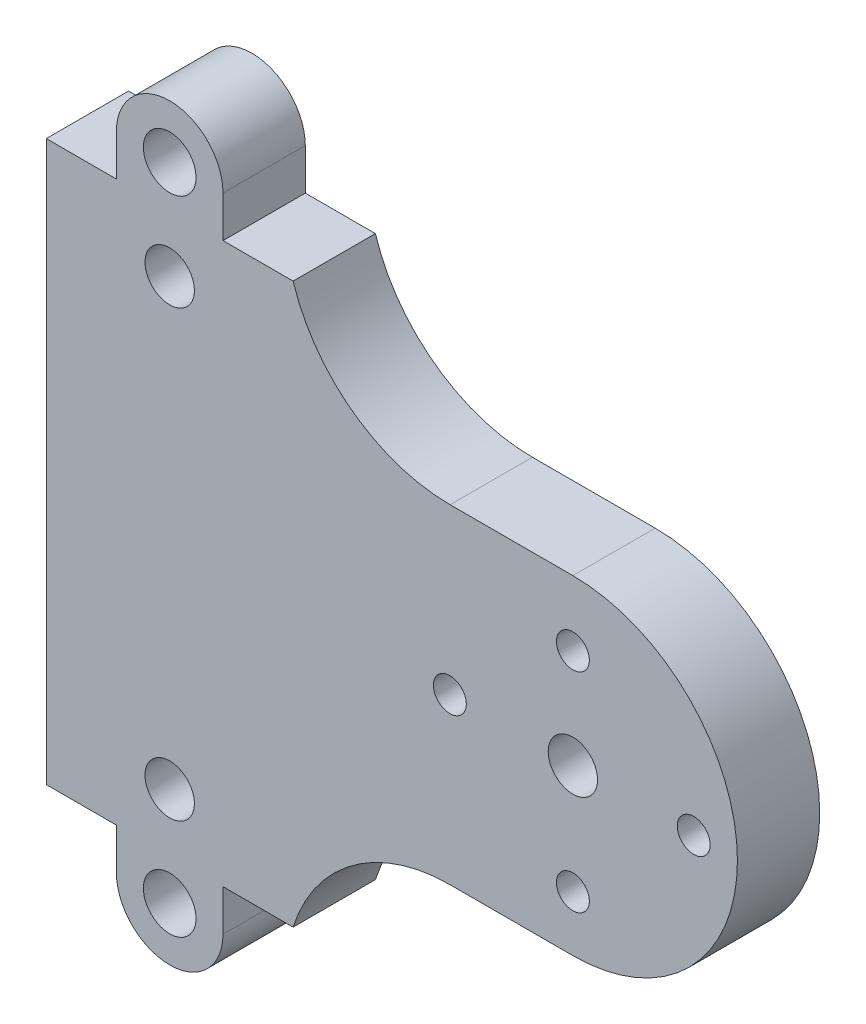
ISO-10303-21;
HEADER;
FILE_DESCRIPTION(('STEP AP214'),'2;1');
FILE_NAME('part.step','',(''),(''),'','','');
FILE_SCHEMA(('AUTOMOTIVE_DESIGN { 1 0 10303 214 1 1 1 1 }'));
ENDSEC;
DATA;
#1=APPLICATION_CONTEXT('core data for automotive mechanical design processes');
#2=APPLICATION_PROTOCOL_DEFINITION('international standard','automotive_design',2000,#1);
#3=PRODUCT_CONTEXT('',#1,'mechanical');
#4=PRODUCT('Part','Part','',(#3));
#5=PRODUCT_RELATED_PRODUCT_CATEGORY('part','',(#4));
#6=PRODUCT_DEFINITION_FORMATION('','',#4);
#7=PRODUCT_DEFINITION_CONTEXT('part definition',#1,'design');
#8=PRODUCT_DEFINITION('design','',#6,#7);
#9=PRODUCT_DEFINITION_SHAPE('','',#8);
#10=(LENGTH_UNIT() NAMED_UNIT(*) SI_UNIT(.MILLI.,.METRE.));
#11=(NAMED_UNIT(*) PLANE_ANGLE_UNIT() SI_UNIT($,.RADIAN.));
#12=(NAMED_UNIT(*) SI_UNIT($,.STERADIAN.) SOLID_ANGLE_UNIT());
#13=UNCERTAINTY_MEASURE_WITH_UNIT(LENGTH_MEASURE(1.E-05),#10,'distance_accuracy_value','');
#14=(GEOMETRIC_REPRESENTATION_CONTEXT(3) GLOBAL_UNCERTAINTY_ASSIGNED_CONTEXT((#13)) GLOBAL_UNIT_ASSIGNED_CONTEXT((#10,
#11,#12)) REPRESENTATION_CONTEXT('',''));
#15=CARTESIAN_POINT('',(0.,0.,0.));
#16=DIRECTION('',(0.,0.,1.));
#17=DIRECTION('',(1.,0.,0.));
#18=AXIS2_PLACEMENT_3D('',#15,#16,#17);
#19=CARTESIAN_POINT('',(-21.5845968576232,7.70287081339713,5.));
#20=DIRECTION('',(0.,-1.,0.));
#21=DIRECTION('',(1.,0.,0.));
#22=AXIS2_PLACEMENT_3D('',#19,#20,#21);
#23=PLANE('',#22);
#24=DIRECTION('',(-1.,0.,0.));
#25=VECTOR('',#24,1.);
#26=CARTESIAN_POINT('',(-21.5845968576232,7.70287081339713,0.));
#27=LINE('',#26,#25);
#28=CARTESIAN_POINT('',(-12.3245968576232,7.70287081339713,0.));
#29=VERTEX_POINT('',#28);
#30=CARTESIAN_POINT('',(-16.5845968576232,7.70287081339713,0.));
#31=VERTEX_POINT('',#30);
#32=EDGE_CURVE('E252',#29,#31,#27,.T.);
#33=ORIENTED_EDGE('',*,*,#32,.T.);
#34=DIRECTION('',(0.,0.,1.));
#35=VECTOR('',#34,1.);
#36=CARTESIAN_POINT('',(-16.5845968576232,7.70287081339713,5.));
#37=LINE('',#36,#35);
#38=CARTESIAN_POINT('',(-16.5845968576232,7.70287081339713,5.));
#39=VERTEX_POINT('',#38);
#40=EDGE_CURVE('E185',#31,#39,#37,.T.);
#41=ORIENTED_EDGE('',*,*,#40,.T.);
#42=DIRECTION('',(-1.,0.,0.));
#43=VECTOR('',#42,1.);
#44=CARTESIAN_POINT('',(-21.5845968576232,7.70287081339713,5.));
#45=LINE('',#44,#43);
#46=CARTESIAN_POINT('',(-12.3245968576232,7.70287081339713,5.));
#47=VERTEX_POINT('',#46);
#48=EDGE_CURVE('E264',#47,#39,#45,.T.);
#49=ORIENTED_EDGE('',*,*,#48,.F.);
#50=DIRECTION('',(0.,0.,-1.));
#51=VECTOR('',#50,1.);
#52=CARTESIAN_POINT('',(-12.3245968576232,7.70287081339713,5.));
#53=LINE('',#52,#51);
#54=EDGE_CURVE('E275',#47,#29,#53,.T.);
#55=ORIENTED_EDGE('',*,*,#54,.T.);
#56=EDGE_LOOP('',(#33,#41,#49,#55));
#57=FACE_BOUND('',#56,.T.);
#58=ADVANCED_FACE('F33',(#57),#23,.F.);
#59=CARTESIAN_POINT('',(-21.5845968576232,-26.2971291866029,5.));
#60=DIRECTION('',(0.,1.,0.));
#61=DIRECTION('',(-1.,0.,0.));
#62=AXIS2_PLACEMENT_3D('',#59,#60,#61);
#63=PLANE('',#62);
#64=DIRECTION('',(1.,0.,0.));
#65=VECTOR('',#64,1.);
#66=CARTESIAN_POINT('',(-21.5845968576232,-26.2971291866029,0.));
#67=LINE('',#66,#65);
#68=CARTESIAN_POINT('',(-5.84459685762318,-26.2971291866029,0.));
#69=VERTEX_POINT('',#68);
#70=CARTESIAN_POINT('',(-1.58459685762318,-26.2971291866029,0.));
#71=VERTEX_POINT('',#70);
#72=EDGE_CURVE('E261',#69,#71,#67,.T.);
#73=ORIENTED_EDGE('',*,*,#72,.T.);
#74=DIRECTION('',(0.,0.,1.));
#75=VECTOR('',#74,1.);
#76=CARTESIAN_POINT('',(-1.58459685762318,-26.2971291866029,5.));
#77=LINE('',#76,#75);
#78=CARTESIAN_POINT('',(-1.58459685762318,-26.2971291866029,5.));
#79=VERTEX_POINT('',#78);
#80=EDGE_CURVE('E181',#71,#79,#77,.T.);
#81=ORIENTED_EDGE('',*,*,#80,.T.);
#82=DIRECTION('',(1.,0.,0.));
#83=VECTOR('',#82,1.);
#84=CARTESIAN_POINT('',(-21.5845968576232,-26.2971291866029,5.));
#85=LINE('',#84,#83);
#86=CARTESIAN_POINT('',(-5.84459685762318,-26.2971291866029,5.));
#87=VERTEX_POINT('',#86);
#88=EDGE_CURVE('E258',#87,#79,#85,.T.);
#89=ORIENTED_EDGE('',*,*,#88,.F.);
#90=DIRECTION('',(0.,0.,-1.));
#91=VECTOR('',#90,1.);
#92=CARTESIAN_POINT('',(-5.84459685762318,-26.2971291866029,5.));
#93=LINE('',#92,#91);
#94=EDGE_CURVE('E269',#87,#69,#93,.T.);
#95=ORIENTED_EDGE('',*,*,#94,.T.);
#96=EDGE_LOOP('',(#73,#81,#89,#95));
#97=FACE_BOUND('',#96,.T.);
#98=ADVANCED_FACE('F297',(#97),#63,.F.);
#99=CARTESIAN_POINT('',(-4.03454117826684,-8.29712918660287,5.));
#100=DIRECTION('',(0.,0.,1.));
#101=DIRECTION('',(1.,0.,0.));
#102=AXIS2_PLACEMENT_3D('',#99,#100,#101);
#103=PLANE('',#102);
#104=DIRECTION('',(1.,0.,0.));
#105=VECTOR('',#104,1.);
#106=CARTESIAN_POINT('',(15.4154031423768,0.702870813397122,5.));
#107=LINE('',#106,#105);
#108=CARTESIAN_POINT('',(7.95479515654627,0.702870813397122,5.));
#109=VERTEX_POINT('',#108);
#110=CARTESIAN_POINT('',(15.4154031423768,0.702870813397122,5.));
#111=VERTEX_POINT('',#110);
#112=EDGE_CURVE('E155',#109,#111,#107,.T.);
#113=ORIENTED_EDGE('',*,*,#112,.F.);
#114=CARTESIAN_POINT('',(7.95479515654627,10.7028708133971,5.));
#115=DIRECTION('',(0.,0.,1.));
#116=DIRECTION('',(1.,0.,0.));
#117=AXIS2_PLACEMENT_3D('',#114,#115,#116);
#118=CIRCLE('',#117,10.);
#119=CARTESIAN_POINT('',(-1.58459685762318,7.70287081339712,5.));
#120=VERTEX_POINT('',#119);
#121=EDGE_CURVE('E290',#109,#120,#118,.F.);
#122=ORIENTED_EDGE('',*,*,#121,.T.);
#123=CARTESIAN_POINT('',(-5.84459685762318,7.70287081339713,5.));
#124=VERTEX_POINT('',#123);
#125=EDGE_CURVE('E262',#120,#124,#45,.T.);
#126=ORIENTED_EDGE('',*,*,#125,.T.);
#127=DIRECTION('',(0.,-1.,0.));
#128=VECTOR('',#127,1.);
#129=CARTESIAN_POINT('',(-5.84459685762318,6.75773830821158,5.));
#130=LINE('',#129,#128);
#131=CARTESIAN_POINT('',(-5.84459685762318,10.2028708133971,5.));
#132=VERTEX_POINT('',#131);
#133=EDGE_CURVE('E198',#132,#124,#130,.T.);
#134=ORIENTED_EDGE('',*,*,#133,.F.);
#135=CARTESIAN_POINT('',(-9.08459685762318,10.2028708133971,5.));
#136=DIRECTION('',(0.,0.,-1.));
#137=DIRECTION('',(-1.,0.,0.));
#138=AXIS2_PLACEMENT_3D('',#135,#136,#137);
#139=CIRCLE('',#138,3.24);
#140=CARTESIAN_POINT('',(-12.3245968576232,10.2028708133971,5.));
#141=VERTEX_POINT('',#140);
#142=EDGE_CURVE('E195',#141,#132,#139,.T.);
#143=ORIENTED_EDGE('',*,*,#142,.F.);
#144=DIRECTION('',(0.,1.,0.));
#145=VECTOR('',#144,1.);
#146=CARTESIAN_POINT('',(-12.3245968576232,6.75773830821158,5.));
#147=LINE('',#146,#145);
#148=EDGE_CURVE('E202',#47,#141,#147,.T.);
#149=ORIENTED_EDGE('',*,*,#148,.F.);
#150=ORIENTED_EDGE('',*,*,#48,.T.);
#151=DIRECTION('',(0.,1.,0.));
#152=VECTOR('',#151,1.);
#153=CARTESIAN_POINT('',(-16.5845968576232,-8.29712918660287,5.));
#154=LINE('',#153,#152);
#155=CARTESIAN_POINT('',(-16.5845968576232,-26.2971291866029,5.));
#156=VERTEX_POINT('',#155);
#157=EDGE_CURVE('E183',#156,#39,#154,.T.);
#158=ORIENTED_EDGE('',*,*,#157,.F.);
#159=CARTESIAN_POINT('',(-12.3245968576232,-26.2971291866029,5.));
#160=VERTEX_POINT('',#159);
#161=EDGE_CURVE('E255',#156,#160,#85,.T.);
#162=ORIENTED_EDGE('',*,*,#161,.T.);
#163=DIRECTION('',(0.,1.,0.));
#164=VECTOR('',#163,1.);
#165=CARTESIAN_POINT('',(-12.3245968576232,-28.7971291866029,5.));
#166=LINE('',#165,#164);
#167=CARTESIAN_POINT('',(-12.3245968576232,-28.7971291866029,5.));
#168=VERTEX_POINT('',#167);
#169=EDGE_CURVE('E225',#168,#160,#166,.T.);
#170=ORIENTED_EDGE('',*,*,#169,.F.);
#171=CARTESIAN_POINT('',(-9.08459685762318,-28.7971291866029,5.));
#172=DIRECTION('',(0.,0.,-1.));
#173=DIRECTION('',(-1.,0.,0.));
#174=AXIS2_PLACEMENT_3D('',#171,#172,#173);
#175=CIRCLE('',#174,3.24);
#176=CARTESIAN_POINT('',(-5.84459685762318,-28.7971291866029,5.));
#177=VERTEX_POINT('',#176);
#178=EDGE_CURVE('E222',#177,#168,#175,.T.);
#179=ORIENTED_EDGE('',*,*,#178,.F.);
#180=DIRECTION('',(0.,-1.,0.));
#181=VECTOR('',#180,1.);
#182=CARTESIAN_POINT('',(-5.84459685762318,-28.7971291866029,5.));
#183=LINE('',#182,#181);
#184=EDGE_CURVE('E229',#87,#177,#183,.T.);
#185=ORIENTED_EDGE('',*,*,#184,.F.);
#186=ORIENTED_EDGE('',*,*,#88,.T.);
#187=CARTESIAN_POINT('',(7.95479515654627,-29.2971291866029,5.));
#188=DIRECTION('',(0.,0.,1.));
#189=DIRECTION('',(1.,0.,0.));
#190=AXIS2_PLACEMENT_3D('',#187,#188,#189);
#191=CIRCLE('',#190,10.);
#192=CARTESIAN_POINT('',(7.95479515654627,-19.2971291866029,5.));
#193=VERTEX_POINT('',#192);
#194=EDGE_CURVE('E11',#79,#193,#191,.F.);
#195=ORIENTED_EDGE('',*,*,#194,.T.);
#196=DIRECTION('',(-1.,0.,0.));
#197=VECTOR('',#196,1.);
#198=CARTESIAN_POINT('',(15.4154031423768,-19.2971291866029,5.));
#199=LINE('',#198,#197);
#200=CARTESIAN_POINT('',(15.4154031423768,-19.2971291866029,5.));
#201=VERTEX_POINT('',#200);
#202=EDGE_CURVE('E147',#201,#193,#199,.T.);
#203=ORIENTED_EDGE('',*,*,#202,.F.);
#204=CARTESIAN_POINT('',(15.4154031423768,-9.29712918660288,5.));
#205=DIRECTION('',(0.,0.,-1.));
#206=DIRECTION('',(-1.,0.,0.));
#207=AXIS2_PLACEMENT_3D('',#204,#205,#206);
#208=CIRCLE('',#207,10.);
#209=EDGE_CURVE('E161',#111,#201,#208,.T.);
#210=ORIENTED_EDGE('',*,*,#209,.F.);
#211=EDGE_LOOP('',(#113,#122,#126,#134,#143,#149,#150,#158,#162,#170,#179,#185,#186,#195,#203,#210));
#212=FACE_BOUND('',#211,.T.);
#213=CARTESIAN_POINT('',(-9.08459685762318,-22.7971291866029,5.));
#214=DIRECTION('',(0.,0.,-1.));
#215=DIRECTION('',(-1.,0.,0.));
#216=AXIS2_PLACEMENT_3D('',#213,#214,#215);
#217=CIRCLE('',#216,1.5);
#218=CARTESIAN_POINT('',(-10.5845968576232,-22.7971291866029,5.));
#219=VERTEX_POINT('',#218);
#220=EDGE_CURVE('E249',#219,#219,#217,.T.);
#221=ORIENTED_EDGE('',*,*,#220,.T.);
#222=EDGE_LOOP('',(#221));
#223=FACE_BOUND('',#222,.T.);
#224=CARTESIAN_POINT('',(-9.08459685762318,4.20287081339712,5.));
#225=DIRECTION('',(0.,0.,-1.));
#226=DIRECTION('',(-1.,0.,0.));
#227=AXIS2_PLACEMENT_3D('',#224,#225,#226);
#228=CIRCLE('',#227,1.5);
#229=CARTESIAN_POINT('',(-10.5845968576232,4.20287081339712,5.));
#230=VERTEX_POINT('',#229);
#231=EDGE_CURVE('E243',#230,#230,#228,.T.);
#232=ORIENTED_EDGE('',*,*,#231,.T.);
#233=EDGE_LOOP('',(#232));
#234=FACE_BOUND('',#233,.T.);
#235=CARTESIAN_POINT('',(-9.08459685762318,-28.7971291866029,5.));
#236=DIRECTION('',(0.,0.,-1.));
#237=DIRECTION('',(-1.,0.,0.));
#238=AXIS2_PLACEMENT_3D('',#235,#236,#237);
#239=CIRCLE('',#238,1.6);
#240=CARTESIAN_POINT('',(-10.6845968576232,-28.7971291866029,5.));
#241=VERTEX_POINT('',#240);
#242=EDGE_CURVE('E216',#241,#241,#239,.T.);
#243=ORIENTED_EDGE('',*,*,#242,.T.);
#244=EDGE_LOOP('',(#243));
#245=FACE_BOUND('',#244,.T.);
#246=CARTESIAN_POINT('',(-9.08459685762318,10.2028708133971,5.));
#247=DIRECTION('',(0.,0.,-1.));
#248=DIRECTION('',(-1.,0.,0.));
#249=AXIS2_PLACEMENT_3D('',#246,#247,#248);
#250=CIRCLE('',#249,1.6);
#251=CARTESIAN_POINT('',(-10.6845968576232,10.2028708133971,5.));
#252=VERTEX_POINT('',#251);
#253=EDGE_CURVE('E189',#252,#252,#250,.T.);
#254=ORIENTED_EDGE('',*,*,#253,.T.);
#255=EDGE_LOOP('',(#254));
#256=FACE_BOUND('',#255,.T.);
#257=CARTESIAN_POINT('',(7.938498128296,-9.29712918660288,5.));
#258=DIRECTION('',(0.,0.,-1.));
#259=DIRECTION('',(-1.,0.,0.));
#260=AXIS2_PLACEMENT_3D('',#257,#258,#259);
#261=CIRCLE('',#260,1.);
#262=CARTESIAN_POINT('',(6.938498128296,-9.29712918660288,5.));
#263=VERTEX_POINT('',#262);
#264=EDGE_CURVE('E434',#263,#263,#261,.T.);
#265=ORIENTED_EDGE('',*,*,#264,.T.);
#266=EDGE_LOOP('',(#265));
#267=FACE_BOUND('',#266,.T.);
#268=CARTESIAN_POINT('',(15.4154031423768,-3.2557102110196,5.));
#269=DIRECTION('',(0.,0.,-1.));
#270=DIRECTION('',(-1.,0.,0.));
#271=AXIS2_PLACEMENT_3D('',#268,#269,#270);
#272=CIRCLE('',#271,1.);
#273=CARTESIAN_POINT('',(14.4154031423768,-3.2557102110196,5.));
#274=VERTEX_POINT('',#273);
#275=EDGE_CURVE('E430',#274,#274,#272,.T.);
#276=ORIENTED_EDGE('',*,*,#275,.T.);
#277=EDGE_LOOP('',(#276));
#278=FACE_BOUND('',#277,.T.);
#279=CARTESIAN_POINT('',(22.7581019317946,-9.29712918660288,5.));
#280=DIRECTION('',(0.,0.,-1.));
#281=DIRECTION('',(-1.,0.,0.));
#282=AXIS2_PLACEMENT_3D('',#279,#280,#281);
#283=CIRCLE('',#282,1.);
#284=CARTESIAN_POINT('',(21.7581019317946,-9.29712918660288,5.));
#285=VERTEX_POINT('',#284);
#286=EDGE_CURVE('E426',#285,#285,#283,.T.);
#287=ORIENTED_EDGE('',*,*,#286,.T.);
#288=EDGE_LOOP('',(#287));
#289=FACE_BOUND('',#288,.T.);
#290=CARTESIAN_POINT('',(15.4154031423768,-15.9342381108966,5.));
#291=DIRECTION('',(0.,0.,-1.));
#292=DIRECTION('',(-1.,0.,0.));
#293=AXIS2_PLACEMENT_3D('',#290,#291,#292);
#294=CIRCLE('',#293,1.);
#295=CARTESIAN_POINT('',(14.4154031423768,-15.9342381108966,5.));
#296=VERTEX_POINT('',#295);
#297=EDGE_CURVE('E420',#296,#296,#294,.T.);
#298=ORIENTED_EDGE('',*,*,#297,.T.);
#299=EDGE_LOOP('',(#298));
#300=FACE_BOUND('',#299,.T.);
#301=CARTESIAN_POINT('',(15.4154031423768,-9.29712918660288,5.));
#302=DIRECTION('',(0.,0.,-1.));
#303=DIRECTION('',(-1.,0.,0.));
#304=AXIS2_PLACEMENT_3D('',#301,#302,#303);
#305=CIRCLE('',#304,1.5);
#306=CARTESIAN_POINT('',(13.9154031423768,-9.29712918660288,5.));
#307=VERTEX_POINT('',#306);
#308=EDGE_CURVE('E176',#307,#307,#305,.T.);
#309=ORIENTED_EDGE('',*,*,#308,.T.);
#310=EDGE_LOOP('',(#309));
#311=FACE_BOUND('',#310,.T.);
#312=ADVANCED_FACE('F159',(#212,#223,#234,#245,#256,#267,#278,#289,#300,#311),#103,.T.);
#313=CARTESIAN_POINT('',(-4.03454117826684,-8.29712918660287,0.));
#314=DIRECTION('',(0.,0.,1.));
#315=DIRECTION('',(1.,0.,0.));
#316=AXIS2_PLACEMENT_3D('',#313,#314,#315);
#317=PLANE('',#316);
#318=CARTESIAN_POINT('',(-1.58459685762318,7.70287081339712,0.));
#319=VERTEX_POINT('',#318);
#320=CARTESIAN_POINT('',(-5.84459685762318,7.70287081339713,0.));
#321=VERTEX_POINT('',#320);
#322=EDGE_CURVE('E265',#319,#321,#27,.T.);
#323=ORIENTED_EDGE('',*,*,#322,.F.);
#324=CARTESIAN_POINT('',(7.95479515654627,10.7028708133971,0.));
#325=DIRECTION('',(0.,0.,1.));
#326=DIRECTION('',(1.,0.,0.));
#327=AXIS2_PLACEMENT_3D('',#324,#325,#326);
#328=CIRCLE('',#327,10.);
#329=CARTESIAN_POINT('',(7.95479515654627,0.702870813397122,0.));
#330=VERTEX_POINT('',#329);
#331=EDGE_CURVE('E288',#319,#330,#328,.T.);
#332=ORIENTED_EDGE('',*,*,#331,.T.);
#333=DIRECTION('',(1.,0.,0.));
#334=VECTOR('',#333,1.);
#335=CARTESIAN_POINT('',(15.4154031423768,0.702870813397122,0.));
#336=LINE('',#335,#334);
#337=CARTESIAN_POINT('',(15.4154031423768,0.702870813397122,0.));
#338=VERTEX_POINT('',#337);
#339=EDGE_CURVE('E166',#330,#338,#336,.T.);
#340=ORIENTED_EDGE('',*,*,#339,.T.);
#341=CARTESIAN_POINT('',(15.4154031423768,-9.29712918660288,0.));
#342=DIRECTION('',(0.,0.,-1.));
#343=DIRECTION('',(-1.,0.,0.));
#344=AXIS2_PLACEMENT_3D('',#341,#342,#343);
#345=CIRCLE('',#344,10.);
#346=CARTESIAN_POINT('',(15.4154031423768,-19.2971291866029,0.));
#347=VERTEX_POINT('',#346);
#348=EDGE_CURVE('E174',#338,#347,#345,.T.);
#349=ORIENTED_EDGE('',*,*,#348,.T.);
#350=DIRECTION('',(-1.,0.,0.));
#351=VECTOR('',#350,1.);
#352=CARTESIAN_POINT('',(15.4154031423768,-19.2971291866029,0.));
#353=LINE('',#352,#351);
#354=CARTESIAN_POINT('',(7.95479515654627,-19.2971291866029,0.));
#355=VERTEX_POINT('',#354);
#356=EDGE_CURVE('E149',#347,#355,#353,.T.);
#357=ORIENTED_EDGE('',*,*,#356,.T.);
#358=CARTESIAN_POINT('',(7.95479515654627,-29.2971291866029,0.));
#359=DIRECTION('',(0.,0.,1.));
#360=DIRECTION('',(1.,0.,0.));
#361=AXIS2_PLACEMENT_3D('',#358,#359,#360);
#362=CIRCLE('',#361,10.);
#363=EDGE_CURVE('E41',#355,#71,#362,.T.);
#364=ORIENTED_EDGE('',*,*,#363,.T.);
#365=ORIENTED_EDGE('',*,*,#72,.F.);
#366=DIRECTION('',(0.,-1.,0.));
#367=VECTOR('',#366,1.);
#368=CARTESIAN_POINT('',(-5.84459685762318,-28.7971291866029,0.));
#369=LINE('',#368,#367);
#370=CARTESIAN_POINT('',(-5.84459685762318,-28.7971291866029,0.));
#371=VERTEX_POINT('',#370);
#372=EDGE_CURVE('E226',#69,#371,#369,.T.);
#373=ORIENTED_EDGE('',*,*,#372,.T.);
#374=CARTESIAN_POINT('',(-9.08459685762318,-28.7971291866029,0.));
#375=DIRECTION('',(0.,0.,-1.));
#376=DIRECTION('',(-1.,0.,0.));
#377=AXIS2_PLACEMENT_3D('',#374,#375,#376);
#378=CIRCLE('',#377,3.24);
#379=CARTESIAN_POINT('',(-12.3245968576232,-28.7971291866029,0.));
#380=VERTEX_POINT('',#379);
#381=EDGE_CURVE('E219',#371,#380,#378,.T.);
#382=ORIENTED_EDGE('',*,*,#381,.T.);
#383=DIRECTION('',(0.,1.,0.));
#384=VECTOR('',#383,1.);
#385=CARTESIAN_POINT('',(-12.3245968576232,-28.7971291866029,0.));
#386=LINE('',#385,#384);
#387=CARTESIAN_POINT('',(-12.3245968576232,-26.2971291866029,0.));
#388=VERTEX_POINT('',#387);
#389=EDGE_CURVE('E234',#380,#388,#386,.T.);
#390=ORIENTED_EDGE('',*,*,#389,.T.);
#391=CARTESIAN_POINT('',(-16.5845968576232,-26.2971291866029,0.));
#392=VERTEX_POINT('',#391);
#393=EDGE_CURVE('E259',#392,#388,#67,.T.);
#394=ORIENTED_EDGE('',*,*,#393,.F.);
#395=DIRECTION('',(0.,-1.,0.));
#396=VECTOR('',#395,1.);
#397=CARTESIAN_POINT('',(-16.5845968576232,-39.0457163873777,0.));
#398=LINE('',#397,#396);
#399=EDGE_CURVE('E178',#31,#392,#398,.T.);
#400=ORIENTED_EDGE('',*,*,#399,.F.);
#401=ORIENTED_EDGE('',*,*,#32,.F.);
#402=DIRECTION('',(0.,1.,0.));
#403=VECTOR('',#402,1.);
#404=CARTESIAN_POINT('',(-12.3245968576232,6.75773830821158,0.));
#405=LINE('',#404,#403);
#406=CARTESIAN_POINT('',(-12.3245968576232,10.2028708133971,0.));
#407=VERTEX_POINT('',#406);
#408=EDGE_CURVE('E199',#29,#407,#405,.T.);
#409=ORIENTED_EDGE('',*,*,#408,.T.);
#410=CARTESIAN_POINT('',(-9.08459685762318,10.2028708133971,0.));
#411=DIRECTION('',(0.,0.,-1.));
#412=DIRECTION('',(-1.,0.,0.));
#413=AXIS2_PLACEMENT_3D('',#410,#411,#412);
#414=CIRCLE('',#413,3.24);
#415=CARTESIAN_POINT('',(-5.84459685762318,10.2028708133971,0.));
#416=VERTEX_POINT('',#415);
#417=EDGE_CURVE('E192',#407,#416,#414,.T.);
#418=ORIENTED_EDGE('',*,*,#417,.T.);
#419=DIRECTION('',(0.,-1.,0.));
#420=VECTOR('',#419,1.);
#421=CARTESIAN_POINT('',(-5.84459685762318,6.75773830821158,0.));
#422=LINE('',#421,#420);
#423=EDGE_CURVE('E207',#416,#321,#422,.T.);
#424=ORIENTED_EDGE('',*,*,#423,.T.);
#425=EDGE_LOOP('',(#323,#332,#340,#349,#357,#364,#365,#373,#382,#390,#394,#400,#401,#409,#418,#424));
#426=FACE_BOUND('',#425,.T.);
#427=CARTESIAN_POINT('',(-9.08459685762318,-22.7971291866029,0.));
#428=DIRECTION('',(0.,0.,-1.));
#429=DIRECTION('',(-1.,0.,0.));
#430=AXIS2_PLACEMENT_3D('',#427,#428,#429);
#431=CIRCLE('',#430,1.5);
#432=CARTESIAN_POINT('',(-10.5845968576232,-22.7971291866029,0.));
#433=VERTEX_POINT('',#432);
#434=EDGE_CURVE('E246',#433,#433,#431,.T.);
#435=ORIENTED_EDGE('',*,*,#434,.F.);
#436=EDGE_LOOP('',(#435));
#437=FACE_BOUND('',#436,.T.);
#438=CARTESIAN_POINT('',(-9.08459685762318,4.20287081339712,0.));
#439=DIRECTION('',(0.,0.,-1.));
#440=DIRECTION('',(-1.,0.,0.));
#441=AXIS2_PLACEMENT_3D('',#438,#439,#440);
#442=CIRCLE('',#441,1.5);
#443=CARTESIAN_POINT('',(-10.5845968576232,4.20287081339712,0.));
#444=VERTEX_POINT('',#443);
#445=EDGE_CURVE('E241',#444,#444,#442,.T.);
#446=ORIENTED_EDGE('',*,*,#445,.F.);
#447=EDGE_LOOP('',(#446));
#448=FACE_BOUND('',#447,.T.);
#449=CARTESIAN_POINT('',(-9.08459685762318,-28.7971291866029,0.));
#450=DIRECTION('',(0.,0.,-1.));
#451=DIRECTION('',(-1.,0.,0.));
#452=AXIS2_PLACEMENT_3D('',#449,#450,#451);
#453=CIRCLE('',#452,1.6);
#454=CARTESIAN_POINT('',(-10.6845968576232,-28.7971291866029,0.));
#455=VERTEX_POINT('',#454);
#456=EDGE_CURVE('E214',#455,#455,#453,.T.);
#457=ORIENTED_EDGE('',*,*,#456,.F.);
#458=EDGE_LOOP('',(#457));
#459=FACE_BOUND('',#458,.T.);
#460=CARTESIAN_POINT('',(-9.08459685762318,10.2028708133971,0.));
#461=DIRECTION('',(0.,0.,-1.));
#462=DIRECTION('',(-1.,0.,0.));
#463=AXIS2_PLACEMENT_3D('',#460,#461,#462);
#464=CIRCLE('',#463,1.6);
#465=CARTESIAN_POINT('',(-10.6845968576232,10.2028708133971,0.));
#466=VERTEX_POINT('',#465);
#467=EDGE_CURVE('E188',#466,#466,#464,.T.);
#468=ORIENTED_EDGE('',*,*,#467,.F.);
#469=EDGE_LOOP('',(#468));
#470=FACE_BOUND('',#469,.T.);
#471=CARTESIAN_POINT('',(7.938498128296,-9.29712918660288,0.));
#472=DIRECTION('',(0.,0.,-1.));
#473=DIRECTION('',(-1.,0.,0.));
#474=AXIS2_PLACEMENT_3D('',#471,#472,#473);
#475=CIRCLE('',#474,1.);
#476=CARTESIAN_POINT('',(6.938498128296,-9.29712918660288,0.));
#477=VERTEX_POINT('',#476);
#478=EDGE_CURVE('E404',#477,#477,#475,.T.);
#479=ORIENTED_EDGE('',*,*,#478,.F.);
#480=EDGE_LOOP('',(#479));
#481=FACE_BOUND('',#480,.T.);
#482=CARTESIAN_POINT('',(15.4154031423768,-3.2557102110196,0.));
#483=DIRECTION('',(0.,0.,-1.));
#484=DIRECTION('',(-1.,0.,0.));
#485=AXIS2_PLACEMENT_3D('',#482,#483,#484);
#486=CIRCLE('',#485,1.);
#487=CARTESIAN_POINT('',(14.4154031423768,-3.2557102110196,0.));
#488=VERTEX_POINT('',#487);
#489=EDGE_CURVE('E408',#488,#488,#486,.T.);
#490=ORIENTED_EDGE('',*,*,#489,.F.);
#491=EDGE_LOOP('',(#490));
#492=FACE_BOUND('',#491,.T.);
#493=CARTESIAN_POINT('',(22.7581019317946,-9.29712918660288,0.));
#494=DIRECTION('',(0.,0.,-1.));
#495=DIRECTION('',(-1.,0.,0.));
#496=AXIS2_PLACEMENT_3D('',#493,#494,#495);
#497=CIRCLE('',#496,1.);
#498=CARTESIAN_POINT('',(21.7581019317946,-9.29712918660288,0.));
#499=VERTEX_POINT('',#498);
#500=EDGE_CURVE('E412',#499,#499,#497,.T.);
#501=ORIENTED_EDGE('',*,*,#500,.F.);
#502=EDGE_LOOP('',(#501));
#503=FACE_BOUND('',#502,.T.);
#504=CARTESIAN_POINT('',(15.4154031423768,-15.9342381108966,0.));
#505=DIRECTION('',(0.,0.,-1.));
#506=DIRECTION('',(-1.,0.,0.));
#507=AXIS2_PLACEMENT_3D('',#504,#505,#506);
#508=CIRCLE('',#507,1.);
#509=CARTESIAN_POINT('',(14.4154031423768,-15.9342381108966,0.));
#510=VERTEX_POINT('',#509);
#511=EDGE_CURVE('E416',#510,#510,#508,.T.);
#512=ORIENTED_EDGE('',*,*,#511,.F.);
#513=EDGE_LOOP('',(#512));
#514=FACE_BOUND('',#513,.T.);
#515=CARTESIAN_POINT('',(15.4154031423768,-9.29712918660288,0.));
#516=DIRECTION('',(0.,0.,-1.));
#517=DIRECTION('',(-1.,0.,0.));
#518=AXIS2_PLACEMENT_3D('',#515,#516,#517);
#519=CIRCLE('',#518,1.5);
#520=CARTESIAN_POINT('',(13.9154031423768,-9.29712918660288,0.));
#521=VERTEX_POINT('',#520);
#522=EDGE_CURVE('E170',#521,#521,#519,.T.);
#523=ORIENTED_EDGE('',*,*,#522,.F.);
#524=EDGE_LOOP('',(#523));
#525=FACE_BOUND('',#524,.T.);
#526=ADVANCED_FACE('F294',(#426,#437,#448,#459,#470,#481,#492,#503,#514,#525),#317,.F.);
#527=ORIENTED_EDGE('',*,*,#161,.F.);
#528=DIRECTION('',(0.,0.,-1.));
#529=VECTOR('',#528,1.);
#530=CARTESIAN_POINT('',(-16.5845968576232,-26.2971291866029,5.));
#531=LINE('',#530,#529);
#532=EDGE_CURVE('E281',#156,#392,#531,.T.);
#533=ORIENTED_EDGE('',*,*,#532,.T.);
#534=ORIENTED_EDGE('',*,*,#393,.T.);
#535=DIRECTION('',(0.,0.,1.));
#536=VECTOR('',#535,1.);
#537=CARTESIAN_POINT('',(-12.3245968576232,-26.2971291866029,5.));
#538=LINE('',#537,#536);
#539=EDGE_CURVE('E257',#388,#160,#538,.T.);
#540=ORIENTED_EDGE('',*,*,#539,.T.);
#541=EDGE_LOOP('',(#527,#533,#534,#540));
#542=FACE_BOUND('',#541,.T.);
#543=ADVANCED_FACE('F315',(#542),#63,.F.);
#544=ORIENTED_EDGE('',*,*,#125,.F.);
#545=DIRECTION('',(0.,0.,-1.));
#546=VECTOR('',#545,1.);
#547=CARTESIAN_POINT('',(-1.58459685762318,7.70287081339712,5.));
#548=LINE('',#547,#546);
#549=EDGE_CURVE('E278',#120,#319,#548,.T.);
#550=ORIENTED_EDGE('',*,*,#549,.T.);
#551=ORIENTED_EDGE('',*,*,#322,.T.);
#552=DIRECTION('',(0.,0.,1.));
#553=VECTOR('',#552,1.);
#554=CARTESIAN_POINT('',(-5.84459685762318,7.70287081339713,5.));
#555=LINE('',#554,#553);
#556=EDGE_CURVE('E272',#321,#124,#555,.T.);
#557=ORIENTED_EDGE('',*,*,#556,.T.);
#558=EDGE_LOOP('',(#544,#550,#551,#557));
#559=FACE_BOUND('',#558,.T.);
#560=ADVANCED_FACE('F310',(#559),#23,.F.);
#561=CARTESIAN_POINT('',(-9.08459685762318,-22.7971291866029,5.));
#562=DIRECTION('',(0.,0.,-1.));
#563=DIRECTION('',(-1.,0.,0.));
#564=AXIS2_PLACEMENT_3D('',#561,#562,#563);
#565=CYLINDRICAL_SURFACE('',#564,1.5);
#566=ORIENTED_EDGE('',*,*,#220,.F.);
#567=EDGE_LOOP('',(#566));
#568=FACE_BOUND('',#567,.T.);
#569=ORIENTED_EDGE('',*,*,#434,.T.);
#570=EDGE_LOOP('',(#569));
#571=FACE_BOUND('',#570,.T.);
#572=ADVANCED_FACE('F319',(#568,#571),#565,.F.);
#573=CARTESIAN_POINT('',(-9.08459685762318,4.20287081339712,5.));
#574=DIRECTION('',(0.,0.,-1.));
#575=DIRECTION('',(-1.,0.,0.));
#576=AXIS2_PLACEMENT_3D('',#573,#574,#575);
#577=CYLINDRICAL_SURFACE('',#576,1.5);
#578=ORIENTED_EDGE('',*,*,#231,.F.);
#579=EDGE_LOOP('',(#578));
#580=FACE_BOUND('',#579,.T.);
#581=ORIENTED_EDGE('',*,*,#445,.T.);
#582=EDGE_LOOP('',(#581));
#583=FACE_BOUND('',#582,.T.);
#584=ADVANCED_FACE('F325',(#580,#583),#577,.F.);
#585=CARTESIAN_POINT('',(-5.84459685762318,-28.7971291866029,5.));
#586=DIRECTION('',(1.,0.,0.));
#587=DIRECTION('',(0.,0.,-1.));
#588=AXIS2_PLACEMENT_3D('',#585,#586,#587);
#589=PLANE('',#588);
#590=ORIENTED_EDGE('',*,*,#94,.F.);
#591=ORIENTED_EDGE('',*,*,#184,.T.);
#592=DIRECTION('',(0.,0.,-1.));
#593=VECTOR('',#592,1.);
#594=CARTESIAN_POINT('',(-5.84459685762318,-28.7971291866029,5.));
#595=LINE('',#594,#593);
#596=EDGE_CURVE('E238',#177,#371,#595,.T.);
#597=ORIENTED_EDGE('',*,*,#596,.T.);
#598=ORIENTED_EDGE('',*,*,#372,.F.);
#599=EDGE_LOOP('',(#590,#591,#597,#598));
#600=FACE_BOUND('',#599,.T.);
#601=ADVANCED_FACE('F375',(#600),#589,.T.);
#602=CARTESIAN_POINT('',(-12.3245968576232,-28.7971291866029,5.));
#603=DIRECTION('',(-1.,0.,0.));
#604=DIRECTION('',(0.,0.,1.));
#605=AXIS2_PLACEMENT_3D('',#602,#603,#604);
#606=PLANE('',#605);
#607=ORIENTED_EDGE('',*,*,#539,.F.);
#608=ORIENTED_EDGE('',*,*,#389,.F.);
#609=DIRECTION('',(0.,0.,-1.));
#610=VECTOR('',#609,1.);
#611=CARTESIAN_POINT('',(-12.3245968576232,-28.7971291866029,5.));
#612=LINE('',#611,#610);
#613=EDGE_CURVE('E231',#168,#380,#612,.T.);
#614=ORIENTED_EDGE('',*,*,#613,.F.);
#615=ORIENTED_EDGE('',*,*,#169,.T.);
#616=EDGE_LOOP('',(#607,#608,#614,#615));
#617=FACE_BOUND('',#616,.T.);
#618=ADVANCED_FACE('F378',(#617),#606,.T.);
#619=CARTESIAN_POINT('',(-9.08459685762318,-28.7971291866029,5.));
#620=DIRECTION('',(0.,0.,-1.));
#621=DIRECTION('',(-1.,0.,0.));
#622=AXIS2_PLACEMENT_3D('',#619,#620,#621);
#623=CYLINDRICAL_SURFACE('',#622,3.24);
#624=ORIENTED_EDGE('',*,*,#381,.F.);
#625=ORIENTED_EDGE('',*,*,#596,.F.);
#626=ORIENTED_EDGE('',*,*,#178,.T.);
#627=ORIENTED_EDGE('',*,*,#613,.T.);
#628=EDGE_LOOP('',(#624,#625,#626,#627));
#629=FACE_BOUND('',#628,.T.);
#630=ADVANCED_FACE('F373',(#629),#623,.T.);
#631=CARTESIAN_POINT('',(-9.08459685762318,-28.7971291866029,5.));
#632=DIRECTION('',(0.,0.,-1.));
#633=DIRECTION('',(-1.,0.,0.));
#634=AXIS2_PLACEMENT_3D('',#631,#632,#633);
#635=CYLINDRICAL_SURFACE('',#634,1.6);
#636=ORIENTED_EDGE('',*,*,#242,.F.);
#637=EDGE_LOOP('',(#636));
#638=FACE_BOUND('',#637,.T.);
#639=ORIENTED_EDGE('',*,*,#456,.T.);
#640=EDGE_LOOP('',(#639));
#641=FACE_BOUND('',#640,.T.);
#642=ADVANCED_FACE('F363',(#638,#641),#635,.F.);
#643=CARTESIAN_POINT('',(-12.3245968576232,6.75773830821158,5.));
#644=DIRECTION('',(-1.,0.,0.));
#645=DIRECTION('',(0.,0.,1.));
#646=AXIS2_PLACEMENT_3D('',#643,#644,#645);
#647=PLANE('',#646);
#648=ORIENTED_EDGE('',*,*,#54,.F.);
#649=ORIENTED_EDGE('',*,*,#148,.T.);
#650=DIRECTION('',(0.,0.,-1.));
#651=VECTOR('',#650,1.);
#652=CARTESIAN_POINT('',(-12.3245968576232,10.2028708133971,5.));
#653=LINE('',#652,#651);
#654=EDGE_CURVE('E211',#141,#407,#653,.T.);
#655=ORIENTED_EDGE('',*,*,#654,.T.);
#656=ORIENTED_EDGE('',*,*,#408,.F.);
#657=EDGE_LOOP('',(#648,#649,#655,#656));
#658=FACE_BOUND('',#657,.T.);
#659=ADVANCED_FACE('F359',(#658),#647,.T.);
#660=CARTESIAN_POINT('',(-5.84459685762318,6.75773830821158,5.));
#661=DIRECTION('',(1.,0.,0.));
#662=DIRECTION('',(0.,0.,-1.));
#663=AXIS2_PLACEMENT_3D('',#660,#661,#662);
#664=PLANE('',#663);
#665=ORIENTED_EDGE('',*,*,#556,.F.);
#666=ORIENTED_EDGE('',*,*,#423,.F.);
#667=DIRECTION('',(0.,0.,-1.));
#668=VECTOR('',#667,1.);
#669=CARTESIAN_POINT('',(-5.84459685762318,10.2028708133971,5.));
#670=LINE('',#669,#668);
#671=EDGE_CURVE('E204',#132,#416,#670,.T.);
#672=ORIENTED_EDGE('',*,*,#671,.F.);
#673=ORIENTED_EDGE('',*,*,#133,.T.);
#674=EDGE_LOOP('',(#665,#666,#672,#673));
#675=FACE_BOUND('',#674,.T.);
#676=ADVANCED_FACE('F362',(#675),#664,.T.);
#677=CARTESIAN_POINT('',(-9.08459685762318,10.2028708133971,5.));
#678=DIRECTION('',(0.,0.,-1.));
#679=DIRECTION('',(-1.,0.,0.));
#680=AXIS2_PLACEMENT_3D('',#677,#678,#679);
#681=CYLINDRICAL_SURFACE('',#680,3.24);
#682=ORIENTED_EDGE('',*,*,#417,.F.);
#683=ORIENTED_EDGE('',*,*,#654,.F.);
#684=ORIENTED_EDGE('',*,*,#142,.T.);
#685=ORIENTED_EDGE('',*,*,#671,.T.);
#686=EDGE_LOOP('',(#682,#683,#684,#685));
#687=FACE_BOUND('',#686,.T.);
#688=ADVANCED_FACE('F357',(#687),#681,.T.);
#689=CARTESIAN_POINT('',(-9.08459685762318,10.2028708133971,5.));
#690=DIRECTION('',(0.,0.,-1.));
#691=DIRECTION('',(-1.,0.,0.));
#692=AXIS2_PLACEMENT_3D('',#689,#690,#691);
#693=CYLINDRICAL_SURFACE('',#692,1.6);
#694=ORIENTED_EDGE('',*,*,#253,.F.);
#695=EDGE_LOOP('',(#694));
#696=FACE_BOUND('',#695,.T.);
#697=ORIENTED_EDGE('',*,*,#467,.T.);
#698=EDGE_LOOP('',(#697));
#699=FACE_BOUND('',#698,.T.);
#700=ADVANCED_FACE('F353',(#696,#699),#693,.F.);
#701=CARTESIAN_POINT('',(-16.5845968576232,-39.0457163873777,10.));
#702=DIRECTION('',(1.,0.,0.));
#703=DIRECTION('',(0.,0.,-1.));
#704=AXIS2_PLACEMENT_3D('',#701,#702,#703);
#705=PLANE('',#704);
#706=ORIENTED_EDGE('',*,*,#399,.T.);
#707=ORIENTED_EDGE('',*,*,#532,.F.);
#708=ORIENTED_EDGE('',*,*,#157,.T.);
#709=ORIENTED_EDGE('',*,*,#40,.F.);
#710=EDGE_LOOP('',(#706,#707,#708,#709));
#711=FACE_BOUND('',#710,.T.);
#712=ADVANCED_FACE('F346',(#711),#705,.F.);
#713=CARTESIAN_POINT('',(15.4154031423768,-9.29712918660288,5.));
#714=DIRECTION('',(0.,0.,-1.));
#715=DIRECTION('',(-1.,0.,0.));
#716=AXIS2_PLACEMENT_3D('',#713,#714,#715);
#717=CYLINDRICAL_SURFACE('',#716,10.);
#718=ORIENTED_EDGE('',*,*,#348,.F.);
#719=DIRECTION('',(0.,0.,-1.));
#720=VECTOR('',#719,1.);
#721=CARTESIAN_POINT('',(15.4154031423768,0.702870813397122,5.));
#722=LINE('',#721,#720);
#723=EDGE_CURVE('E154',#111,#338,#722,.T.);
#724=ORIENTED_EDGE('',*,*,#723,.F.);
#725=ORIENTED_EDGE('',*,*,#209,.T.);
#726=DIRECTION('',(0.,0.,-1.));
#727=VECTOR('',#726,1.);
#728=CARTESIAN_POINT('',(15.4154031423768,-19.2971291866029,5.));
#729=LINE('',#728,#727);
#730=EDGE_CURVE('E145',#201,#347,#729,.T.);
#731=ORIENTED_EDGE('',*,*,#730,.T.);
#732=EDGE_LOOP('',(#718,#724,#725,#731));
#733=FACE_BOUND('',#732,.T.);
#734=ADVANCED_FACE('F164',(#733),#717,.T.);
#735=CARTESIAN_POINT('',(15.4154031423768,0.702870813397122,5.));
#736=DIRECTION('',(0.,1.,0.));
#737=DIRECTION('',(0.,0.,1.));
#738=AXIS2_PLACEMENT_3D('',#735,#736,#737);
#739=PLANE('',#738);
#740=ORIENTED_EDGE('',*,*,#339,.F.);
#741=DIRECTION('',(0.,0.,-1.));
#742=VECTOR('',#741,1.);
#743=CARTESIAN_POINT('',(7.95479515654627,0.702870813397122,5.));
#744=LINE('',#743,#742);
#745=EDGE_CURVE('E284',#330,#109,#744,.F.);
#746=ORIENTED_EDGE('',*,*,#745,.T.);
#747=ORIENTED_EDGE('',*,*,#112,.T.);
#748=ORIENTED_EDGE('',*,*,#723,.T.);
#749=EDGE_LOOP('',(#740,#746,#747,#748));
#750=FACE_BOUND('',#749,.T.);
#751=ADVANCED_FACE('F337',(#750),#739,.T.);
#752=CARTESIAN_POINT('',(15.4154031423768,-19.2971291866029,5.));
#753=DIRECTION('',(0.,-1.,0.));
#754=DIRECTION('',(0.,0.,-1.));
#755=AXIS2_PLACEMENT_3D('',#752,#753,#754);
#756=PLANE('',#755);
#757=ORIENTED_EDGE('',*,*,#202,.T.);
#758=DIRECTION('',(0.,0.,1.));
#759=VECTOR('',#758,1.);
#760=CARTESIAN_POINT('',(7.95479515654627,-19.2971291866029,0.));
#761=LINE('',#760,#759);
#762=EDGE_CURVE('E286',#193,#355,#761,.F.);
#763=ORIENTED_EDGE('',*,*,#762,.T.);
#764=ORIENTED_EDGE('',*,*,#356,.F.);
#765=ORIENTED_EDGE('',*,*,#730,.F.);
#766=EDGE_LOOP('',(#757,#763,#764,#765));
#767=FACE_BOUND('',#766,.T.);
#768=ADVANCED_FACE('F146',(#767),#756,.T.);
#769=CARTESIAN_POINT('',(15.4154031423768,-9.29712918660288,5.));
#770=DIRECTION('',(0.,0.,-1.));
#771=DIRECTION('',(-1.,0.,0.));
#772=AXIS2_PLACEMENT_3D('',#769,#770,#771);
#773=CYLINDRICAL_SURFACE('',#772,1.5);
#774=ORIENTED_EDGE('',*,*,#308,.F.);
#775=EDGE_LOOP('',(#774));
#776=FACE_BOUND('',#775,.T.);
#777=ORIENTED_EDGE('',*,*,#522,.T.);
#778=EDGE_LOOP('',(#777));
#779=FACE_BOUND('',#778,.T.);
#780=ADVANCED_FACE('F344',(#776,#779),#773,.F.);
#781=CARTESIAN_POINT('',(15.4154031423768,-15.9342381108966,5.));
#782=DIRECTION('',(0.,0.,-1.));
#783=DIRECTION('',(-1.,0.,0.));
#784=AXIS2_PLACEMENT_3D('',#781,#782,#783);
#785=CYLINDRICAL_SURFACE('',#784,1.);
#786=ORIENTED_EDGE('',*,*,#297,.F.);
#787=EDGE_LOOP('',(#786));
#788=FACE_BOUND('',#787,.T.);
#789=ORIENTED_EDGE('',*,*,#511,.T.);
#790=EDGE_LOOP('',(#789));
#791=FACE_BOUND('',#790,.T.);
#792=ADVANCED_FACE('F455',(#788,#791),#785,.F.);
#793=CARTESIAN_POINT('',(22.7581019317946,-9.29712918660288,5.));
#794=DIRECTION('',(0.,0.,-1.));
#795=DIRECTION('',(-1.,0.,0.));
#796=AXIS2_PLACEMENT_3D('',#793,#794,#795);
#797=CYLINDRICAL_SURFACE('',#796,1.);
#798=ORIENTED_EDGE('',*,*,#286,.F.);
#799=EDGE_LOOP('',(#798));
#800=FACE_BOUND('',#799,.T.);
#801=ORIENTED_EDGE('',*,*,#500,.T.);
#802=EDGE_LOOP('',(#801));
#803=FACE_BOUND('',#802,.T.);
#804=ADVANCED_FACE('F450',(#800,#803),#797,.F.);
#805=CARTESIAN_POINT('',(15.4154031423768,-3.2557102110196,5.));
#806=DIRECTION('',(0.,0.,-1.));
#807=DIRECTION('',(-1.,0.,0.));
#808=AXIS2_PLACEMENT_3D('',#805,#806,#807);
#809=CYLINDRICAL_SURFACE('',#808,1.);
#810=ORIENTED_EDGE('',*,*,#275,.F.);
#811=EDGE_LOOP('',(#810));
#812=FACE_BOUND('',#811,.T.);
#813=ORIENTED_EDGE('',*,*,#489,.T.);
#814=EDGE_LOOP('',(#813));
#815=FACE_BOUND('',#814,.T.);
#816=ADVANCED_FACE('F445',(#812,#815),#809,.F.);
#817=CARTESIAN_POINT('',(7.938498128296,-9.29712918660288,5.));
#818=DIRECTION('',(0.,0.,-1.));
#819=DIRECTION('',(-1.,0.,0.));
#820=AXIS2_PLACEMENT_3D('',#817,#818,#819);
#821=CYLINDRICAL_SURFACE('',#820,1.);
#822=ORIENTED_EDGE('',*,*,#264,.F.);
#823=EDGE_LOOP('',(#822));
#824=FACE_BOUND('',#823,.T.);
#825=ORIENTED_EDGE('',*,*,#478,.T.);
#826=EDGE_LOOP('',(#825));
#827=FACE_BOUND('',#826,.T.);
#828=ADVANCED_FACE('F305',(#824,#827),#821,.F.);
#829=CARTESIAN_POINT('',(7.95479515654627,10.7028708133971,10.));
#830=DIRECTION('',(0.,0.,1.));
#831=DIRECTION('',(1.,0.,0.));
#832=AXIS2_PLACEMENT_3D('',#829,#830,#831);
#833=CYLINDRICAL_SURFACE('',#832,10.);
#834=ORIENTED_EDGE('',*,*,#121,.F.);
#835=ORIENTED_EDGE('',*,*,#745,.F.);
#836=ORIENTED_EDGE('',*,*,#331,.F.);
#837=ORIENTED_EDGE('',*,*,#549,.F.);
#838=EDGE_LOOP('',(#834,#835,#836,#837));
#839=FACE_BOUND('',#838,.T.);
#840=ADVANCED_FACE('F301',(#839),#833,.F.);
#841=CARTESIAN_POINT('',(7.95479515654627,-29.2971291866029,10.));
#842=DIRECTION('',(0.,0.,-1.));
#843=DIRECTION('',(-1.,0.,0.));
#844=AXIS2_PLACEMENT_3D('',#841,#842,#843);
#845=CYLINDRICAL_SURFACE('',#844,10.);
#846=ORIENTED_EDGE('',*,*,#194,.F.);
#847=ORIENTED_EDGE('',*,*,#80,.F.);
#848=ORIENTED_EDGE('',*,*,#363,.F.);
#849=ORIENTED_EDGE('',*,*,#762,.F.);
#850=EDGE_LOOP('',(#846,#847,#848,#849));
#851=FACE_BOUND('',#850,.T.);
#852=ADVANCED_FACE('F35',(#851),#845,.F.);
#853=CLOSED_SHELL('',(#58,#98,#312,#526,#543,#560,#572,#584,#601,#618,#630,#642,#659,#676,#688,
#700,#712,#734,#751,#768,#780,#792,#804,#816,#828,#840,#852));
#854=MANIFOLD_SOLID_BREP('B2',#853);
#855=ADVANCED_BREP_SHAPE_REPRESENTATION('',(#18,#854),#14);
#856=SHAPE_DEFINITION_REPRESENTATION(#9,#855);
ENDSEC;
END-ISO-10303-21;
